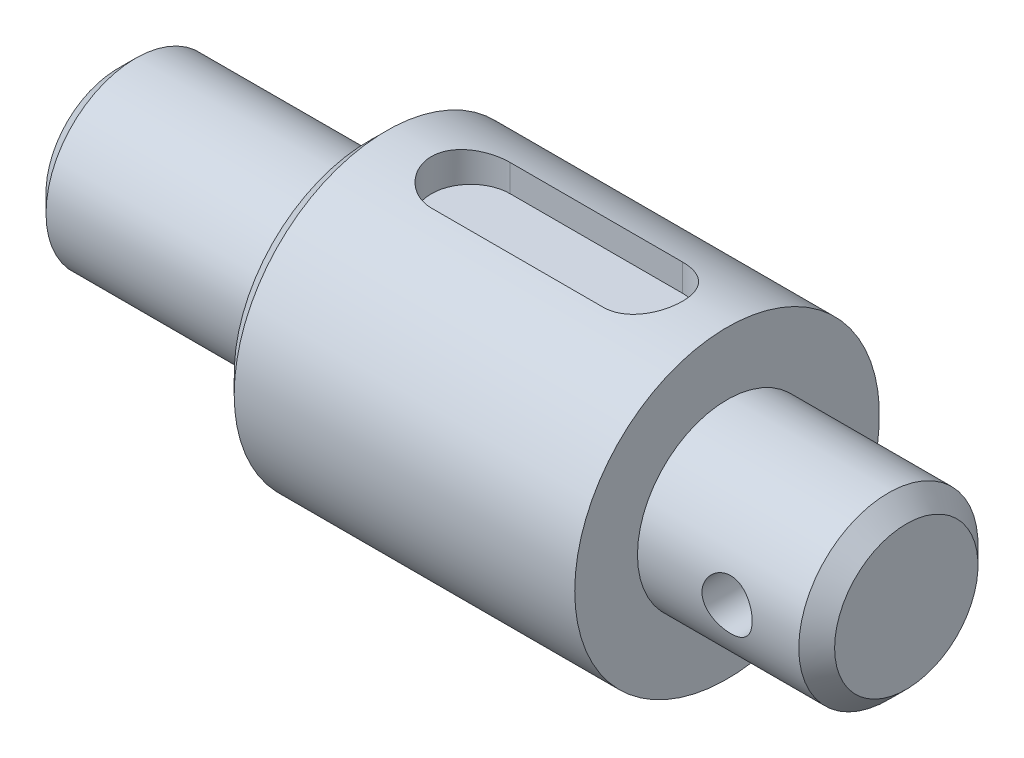
ISO-10303-21;
HEADER;
FILE_DESCRIPTION(('STEP AP214'),'2;1');
FILE_NAME('part.step','',(''),(''),'','','');
FILE_SCHEMA(('AUTOMOTIVE_DESIGN { 1 0 10303 214 1 1 1 1 }'));
ENDSEC;
DATA;
#1=APPLICATION_CONTEXT('core data for automotive mechanical design processes');
#2=APPLICATION_PROTOCOL_DEFINITION('international standard','automotive_design',2000,#1);
#3=PRODUCT_CONTEXT('',#1,'mechanical');
#4=PRODUCT('Part','Part','',(#3));
#5=PRODUCT_RELATED_PRODUCT_CATEGORY('part','',(#4));
#6=PRODUCT_DEFINITION_FORMATION('','',#4);
#7=PRODUCT_DEFINITION_CONTEXT('part definition',#1,'design');
#8=PRODUCT_DEFINITION('design','',#6,#7);
#9=PRODUCT_DEFINITION_SHAPE('','',#8);
#10=(LENGTH_UNIT() NAMED_UNIT(*) SI_UNIT(.MILLI.,.METRE.));
#11=(NAMED_UNIT(*) PLANE_ANGLE_UNIT() SI_UNIT($,.RADIAN.));
#12=(NAMED_UNIT(*) SI_UNIT($,.STERADIAN.) SOLID_ANGLE_UNIT());
#13=UNCERTAINTY_MEASURE_WITH_UNIT(LENGTH_MEASURE(1.E-05),#10,'distance_accuracy_value','');
#14=(GEOMETRIC_REPRESENTATION_CONTEXT(3) GLOBAL_UNCERTAINTY_ASSIGNED_CONTEXT((#13)) GLOBAL_UNIT_ASSIGNED_CONTEXT((#10,
#11,#12)) REPRESENTATION_CONTEXT('',''));
#15=CARTESIAN_POINT('',(0.,0.,0.));
#16=DIRECTION('',(0.,0.,1.));
#17=DIRECTION('',(1.,0.,0.));
#18=AXIS2_PLACEMENT_3D('',#15,#16,#17);
#19=CARTESIAN_POINT('',(0.,0.,0.));
#20=DIRECTION('',(-1.,0.,0.));
#21=DIRECTION('',(0.,0.,1.));
#22=AXIS2_PLACEMENT_3D('',#19,#20,#21);
#23=CYLINDRICAL_SURFACE('',#22,42.5);
#24=CARTESIAN_POINT('',(5.00000000000007,0.,0.));
#25=DIRECTION('',(1.,0.,0.));
#26=DIRECTION('',(0.,0.,-1.));
#27=AXIS2_PLACEMENT_3D('',#24,#25,#26);
#28=CIRCLE('',#27,42.5);
#29=CARTESIAN_POINT('',(5.00000000000007,0.,-42.5));
#30=VERTEX_POINT('',#29);
#31=EDGE_CURVE('E184',#30,#30,#28,.T.);
#32=ORIENTED_EDGE('',*,*,#31,.T.);
#33=EDGE_LOOP('',(#32));
#34=FACE_BOUND('',#33,.T.);
#35=CARTESIAN_POINT('',(100.,0.,0.));
#36=DIRECTION('',(-1.,0.,0.));
#37=DIRECTION('',(0.,0.,1.));
#38=AXIS2_PLACEMENT_3D('',#35,#36,#37);
#39=CIRCLE('',#38,42.5);
#40=CARTESIAN_POINT('',(100.,0.,42.5));
#41=VERTEX_POINT('',#40);
#42=EDGE_CURVE('E171',#41,#41,#39,.T.);
#43=ORIENTED_EDGE('',*,*,#42,.T.);
#44=EDGE_LOOP('',(#43));
#45=FACE_BOUND('',#44,.T.);
#46=CARTESIAN_POINT('',(76.5,41.051796550212,11.));
#47=CARTESIAN_POINT('',(76.8038247960372,41.0517600565118,11.0000389542306));
#48=CARTESIAN_POINT('',(77.1076367714444,41.0551682326324,10.9874140837727));
#49=CARTESIAN_POINT('',(77.7129813918098,41.0686081674394,10.9371235302487));
#50=CARTESIAN_POINT('',(78.014514431399,41.0786387514863,10.8994622879622));
#51=CARTESIAN_POINT('',(78.6125383491229,41.1050306264776,10.7994890289192));
#52=CARTESIAN_POINT('',(78.9090383580282,41.1213787941665,10.7372281060893));
#53=CARTESIAN_POINT('',(79.4955429173753,41.1599040034349,10.5885896094699));
#54=CARTESIAN_POINT('',(79.7855473655571,41.1820811367102,10.5022116562923));
#55=CARTESIAN_POINT('',(80.3569587250626,41.2316033657133,10.3060705109614));
#56=CARTESIAN_POINT('',(80.638368700337,41.2589465941317,10.1963157666392));
#57=CARTESIAN_POINT('',(81.1909337441658,41.3180270828473,9.95420329262288));
#58=CARTESIAN_POINT('',(81.4620849075802,41.3497659954088,9.82183705925984));
#59=CARTESIAN_POINT('',(81.9922337819806,41.4167295161546,9.53551866765559));
#60=CARTESIAN_POINT('',(82.2512332204764,41.4519536266503,9.38156959015381));
#61=CARTESIAN_POINT('',(82.7556058932019,41.5249358395073,9.05306668291794));
#62=CARTESIAN_POINT('',(83.000972813508,41.5626950984392,8.8785034207607));
#63=CARTESIAN_POINT('',(83.481459878544,41.640525790582,8.5060888668767));
#64=CARTESIAN_POINT('',(83.7162539321709,41.6806292223046,8.30782341742722));
#65=CARTESIAN_POINT('',(84.1683003877674,41.7612664734894,7.89248653985834));
#66=CARTESIAN_POINT('',(84.3855602836484,41.8018001006195,7.67542322885662));
#67=CARTESIAN_POINT('',(84.8013524344074,41.8822255157637,7.2236994530539));
#68=CARTESIAN_POINT('',(84.9998739445335,41.9221169247815,6.98902902893964));
#69=CARTESIAN_POINT('',(85.3766433414834,42.0001289519643,6.5038078492657));
#70=CARTESIAN_POINT('',(85.5548988224922,42.0382502302523,6.25326309738375));
#71=CARTESIAN_POINT('',(85.8925371639026,42.1122571236067,5.73390201211311));
#72=CARTESIAN_POINT('',(86.0515906699277,42.1480997664555,5.46486526447001));
#73=CARTESIAN_POINT('',(86.3464100576671,42.2158880021883,4.91384215852889));
#74=CARTESIAN_POINT('',(86.4821756323285,42.2478335436872,4.63185562954937));
#75=CARTESIAN_POINT('',(86.7293199755572,42.3069094034313,4.05695587135449));
#76=CARTESIAN_POINT('',(86.8407029071338,42.3340405435209,3.76404451741729));
#77=CARTESIAN_POINT('',(87.0381815007191,42.3827099496211,3.16936632313256));
#78=CARTESIAN_POINT('',(87.1242777961988,42.4042483557371,2.86759970483205));
#79=CARTESIAN_POINT('',(87.2688557907995,42.4407053090022,2.26405512187304));
#80=CARTESIAN_POINT('',(87.3278944946583,42.4557569624669,1.96241857625775));
#81=CARTESIAN_POINT('',(87.4205451242372,42.4794808711728,1.35501629776593));
#82=CARTESIAN_POINT('',(87.4541573807001,42.4881532093949,1.0492506186531));
#83=CARTESIAN_POINT('',(87.4956566003813,42.4988712932307,0.4358979251653));
#84=CARTESIAN_POINT('',(87.5035465339829,42.500917803987,0.128311125201218));
#85=CARTESIAN_POINT('',(87.4935388098912,42.4983278610524,-0.486412192507667));
#86=CARTESIAN_POINT('',(87.4756414967699,42.4936914966589,-0.793548716214219));
#87=CARTESIAN_POINT('',(87.4149524279946,42.4780573464952,-1.39778669305792));
#88=CARTESIAN_POINT('',(87.3727636678717,42.4672136833787,-1.69495294050582));
#89=CARTESIAN_POINT('',(87.2643196451943,42.4395785908353,-2.28457287339462));
#90=CARTESIAN_POINT('',(87.1980648301484,42.4227872720053,-2.57702664635843));
#91=CARTESIAN_POINT('',(87.0420248603992,42.3837066426528,-3.15521462031182));
#92=CARTESIAN_POINT('',(86.9522391254991,42.3614171965651,-3.44094865542495));
#93=CARTESIAN_POINT('',(86.7498402981266,42.3119321671073,-4.0037748141211));
#94=CARTESIAN_POINT('',(86.6372268634882,42.2847365101983,-4.28086680809616));
#95=CARTESIAN_POINT('',(86.3888617745791,42.2258795389272,-4.82713965074313));
#96=CARTESIAN_POINT('',(86.2529038758076,42.1941788957633,-5.09622246351621));
#97=CARTESIAN_POINT('',(85.9595317081342,42.1273348541285,-5.62209451939259));
#98=CARTESIAN_POINT('',(85.8021100242559,42.0921902670827,-5.87887947241421));
#99=CARTESIAN_POINT('',(85.4669444991805,42.0193924864097,-6.37843046167639));
#100=CARTESIAN_POINT('',(85.2892014608193,41.9817393919108,-6.62119705117068));
#101=CARTESIAN_POINT('',(84.9145661608773,41.9049080580115,-7.0912199355925));
#102=CARTESIAN_POINT('',(84.717673490958,41.8657297860997,-7.31847589960237));
#103=CARTESIAN_POINT('',(84.3000141469817,41.7857273649808,-7.76243119079863));
#104=CARTESIAN_POINT('',(84.07872004906,41.7448884678229,-7.97863198504914));
#105=CARTESIAN_POINT('',(83.6187234841881,41.663833176894,-8.39162010813873));
#106=CARTESIAN_POINT('',(83.3800263501476,41.6236165969641,-8.58841334101835));
#107=CARTESIAN_POINT('',(82.8866084401968,41.5449086919997,-8.96141290764789));
#108=CARTESIAN_POINT('',(82.6318803689277,41.5064181663039,-9.13760976264419));
#109=CARTESIAN_POINT('',(82.1081811379483,41.4322883836905,-9.46806022838166));
#110=CARTESIAN_POINT('',(81.8392104256986,41.3966490372858,-9.62231452793056));
#111=CARTESIAN_POINT('',(81.2871282267387,41.3290587682055,-9.9086165573765));
#112=CARTESIAN_POINT('',(81.0039402198341,41.2971317736082,-10.0405224882976));
#113=CARTESIAN_POINT('',(80.4269387114262,41.2381922978351,-10.279917478571));
#114=CARTESIAN_POINT('',(80.1331256909791,41.2111795944939,-10.3874076417665));
#115=CARTESIAN_POINT('',(79.5373426054097,41.1629373787932,-10.5769633921626));
#116=CARTESIAN_POINT('',(79.2353829202344,41.1417008569185,-10.6590598119541));
#117=CARTESIAN_POINT('',(78.6253224476552,41.1056483810211,-10.7972572848635));
#118=CARTESIAN_POINT('',(78.3172245997699,41.0908294274753,-10.8533704831951));
#119=CARTESIAN_POINT('',(77.7574803741889,41.0702937207026,-10.9307957004318));
#120=CARTESIAN_POINT('',(77.5065103580855,41.0633671545445,-10.9567539266736));
#121=CARTESIAN_POINT('',(77.0037004580398,41.0541141612397,-10.9913499362758));
#122=CARTESIAN_POINT('',(76.7518626149419,41.0517803736274,-11.0000154335734));
#123=CARTESIAN_POINT('',(76.5,41.051796550212,-11.));
#124=B_SPLINE_CURVE_WITH_KNOTS('',3,(#46,#47,#48,#49,#50,#51,#52,#53,#54,#55,#56,#57,#58,#59,
#60,#61,#62,#63,#64,#65,#66,#67,#68,#69,#70,#71,#72,#73,#74,#75,#76,#77,#78,#79,#80,#81,#82,#83,
#84,#85,#86,#87,#88,#89,#90,#91,#92,#93,#94,#95,#96,#97,#98,#99,#100,#101,#102,#103,#104,#105,
#106,#107,#108,#109,#110,#111,#112,#113,#114,#115,#116,#117,#118,#119,#120,#121,#122,#123),
.UNSPECIFIED.,.F.,.F.,(4,2,2,2,2,2,2,2,2,2,2,2,2,2,2,2,2,2,2,2,2,2,2,2,2,2,2,2,2,2,2,2,2,2,2,2,
2,2,4),(0.,0.911173502419548,1.82218543025096,2.73131503575788,3.64045894370677,
4.54927486384538,5.45843332456371,6.36746214370394,7.27690853028864,8.20557266918207,
9.13383778162453,10.0626319762603,10.9910769734126,11.9336842464295,12.8763039468247,
13.8187625818026,14.7611976046551,15.6832484773341,16.6052873559319,17.5272197547951,
18.4491398348059,19.3491049665557,20.2490533642994,21.1490239539614,22.0490080343384,
22.9573961446463,23.8660988697237,24.7747657070705,25.6834519246785,26.618538565395,
27.5533398569813,28.4885696779902,29.4237701343361,30.3646985689073,31.3055844553859,
32.2453234109839,33.1846226643562,33.9412170434728,34.6965979008401),.UNSPECIFIED.);
#125=CARTESIAN_POINT('',(76.5,41.051796550212,11.));
#126=VERTEX_POINT('',#125);
#127=CARTESIAN_POINT('',(76.5,41.051796550212,-11.));
#128=VERTEX_POINT('',#127);
#129=EDGE_CURVE('E111',#126,#128,#124,.T.);
#130=ORIENTED_EDGE('',*,*,#129,.F.);
#131=DIRECTION('',(-1.,0.,0.));
#132=VECTOR('',#131,1.);
#133=CARTESIAN_POINT('',(0.,41.051796550212,11.));
#134=LINE('',#133,#132);
#135=CARTESIAN_POINT('',(28.5,41.051796550212,11.));
#136=VERTEX_POINT('',#135);
#137=EDGE_CURVE('E47',#136,#126,#134,.F.);
#138=ORIENTED_EDGE('',*,*,#137,.F.);
#139=CARTESIAN_POINT('',(28.5,41.051796550212,-11.));
#140=CARTESIAN_POINT('',(28.1961752039628,41.0517600565118,-11.0000389542306));
#141=CARTESIAN_POINT('',(27.8923632285556,41.0551682326324,-10.9874140837727));
#142=CARTESIAN_POINT('',(27.2870186081902,41.0686081674394,-10.9371235302487));
#143=CARTESIAN_POINT('',(26.985485568601,41.0786387514863,-10.8994622879622));
#144=CARTESIAN_POINT('',(26.3874616508772,41.1050306264776,-10.7994890289192));
#145=CARTESIAN_POINT('',(26.0909616419719,41.1213787941665,-10.7372281060893));
#146=CARTESIAN_POINT('',(25.5044570826248,41.1599040034349,-10.5885896094699));
#147=CARTESIAN_POINT('',(25.214452634443,41.1820811367102,-10.5022116562923));
#148=CARTESIAN_POINT('',(24.6430412749374,41.2316033657133,-10.3060705109614));
#149=CARTESIAN_POINT('',(24.3616312996631,41.2589465941317,-10.1963157666392));
#150=CARTESIAN_POINT('',(23.8090662558342,41.3180270828473,-9.95420329262288));
#151=CARTESIAN_POINT('',(23.5379150924198,41.3497659954088,-9.82183705925984));
#152=CARTESIAN_POINT('',(23.0077662180195,41.4167295161546,-9.53551866765559));
#153=CARTESIAN_POINT('',(22.7487667795236,41.4519536266503,-9.38156959015381));
#154=CARTESIAN_POINT('',(22.2443941067982,41.5249358395073,-9.05306668291793));
#155=CARTESIAN_POINT('',(21.9990271864921,41.5626950984392,-8.87850342076069));
#156=CARTESIAN_POINT('',(21.5185401214561,41.640525790582,-8.50608886687669));
#157=CARTESIAN_POINT('',(21.2837460678291,41.6806292223046,-8.30782341742721));
#158=CARTESIAN_POINT('',(20.8316996122327,41.7612664734894,-7.89248653985833));
#159=CARTESIAN_POINT('',(20.6144397163517,41.8018001006196,-7.67542322885661));
#160=CARTESIAN_POINT('',(20.1986475655927,41.8822255157637,-7.22369945305389));
#161=CARTESIAN_POINT('',(20.0001260554665,41.9221169247815,-6.98902902893963));
#162=CARTESIAN_POINT('',(19.6233566585166,42.0001289519643,-6.50380784926569));
#163=CARTESIAN_POINT('',(19.4451011775079,42.0382502302523,-6.25326309738374));
#164=CARTESIAN_POINT('',(19.1074628360974,42.1122571236067,-5.73390201211311));
#165=CARTESIAN_POINT('',(18.9484093300723,42.1480997664555,-5.46486526447));
#166=CARTESIAN_POINT('',(18.653589942333,42.2158880021883,-4.91384215852888));
#167=CARTESIAN_POINT('',(18.5178243676715,42.2478335436872,-4.63185562954937));
#168=CARTESIAN_POINT('',(18.2706800244428,42.3069094034313,-4.05695587135448));
#169=CARTESIAN_POINT('',(18.1592970928662,42.3340405435209,-3.76404451741729));
#170=CARTESIAN_POINT('',(17.9618184992809,42.3827099496211,-3.16936632313255));
#171=CARTESIAN_POINT('',(17.8757222038012,42.4042483557371,-2.86759970483204));
#172=CARTESIAN_POINT('',(17.7311442092005,42.4407053090022,-2.26405512187302));
#173=CARTESIAN_POINT('',(17.6721055053418,42.4557569624669,-1.96241857625774));
#174=CARTESIAN_POINT('',(17.5794548757628,42.4794808711728,-1.35501629776592));
#175=CARTESIAN_POINT('',(17.5458426192999,42.4881532093949,-1.04925061865309));
#176=CARTESIAN_POINT('',(17.5043433996188,42.4988712932307,-0.435897925165289));
#177=CARTESIAN_POINT('',(17.4964534660171,42.500917803987,-0.128311125201207));
#178=CARTESIAN_POINT('',(17.5064611901089,42.4983278610524,0.486412192507678));
#179=CARTESIAN_POINT('',(17.5243585032301,42.4936914966589,0.793548716214231));
#180=CARTESIAN_POINT('',(17.5850475720055,42.4780573464952,1.39778669305793));
#181=CARTESIAN_POINT('',(17.6272363321283,42.4672136833787,1.69495294050583));
#182=CARTESIAN_POINT('',(17.7356803548057,42.4395785908353,2.28457287339463));
#183=CARTESIAN_POINT('',(17.8019351698517,42.4227872720053,2.57702664635845));
#184=CARTESIAN_POINT('',(17.9579751396009,42.3837066426528,3.15521462031183));
#185=CARTESIAN_POINT('',(18.0477608745009,42.3614171965651,3.44094865542497));
#186=CARTESIAN_POINT('',(18.2501597018735,42.3119321671073,4.00377481412112));
#187=CARTESIAN_POINT('',(18.3627731365119,42.2847365101983,4.28086680809618));
#188=CARTESIAN_POINT('',(18.611138225421,42.2258795389272,4.82713965074313));
#189=CARTESIAN_POINT('',(18.7470961241924,42.1941788957633,5.09622246351622));
#190=CARTESIAN_POINT('',(19.0404682918659,42.1273348541285,5.6220945193926));
#191=CARTESIAN_POINT('',(19.1978899757442,42.0921902670827,5.87887947241421));
#192=CARTESIAN_POINT('',(19.5330555008196,42.0193924864097,6.37843046167639));
#193=CARTESIAN_POINT('',(19.7107985391807,41.9817393919108,6.62119705117067));
#194=CARTESIAN_POINT('',(20.0854338391228,41.9049080580115,7.0912199355925));
#195=CARTESIAN_POINT('',(20.282326509042,41.8657297860997,7.31847589960238));
#196=CARTESIAN_POINT('',(20.6999858530183,41.7857273649808,7.76243119079864));
#197=CARTESIAN_POINT('',(20.9212799509401,41.7448884678229,7.97863198504915));
#198=CARTESIAN_POINT('',(21.3812765158119,41.663833176894,8.39162010813873));
#199=CARTESIAN_POINT('',(21.6199736498525,41.6236165969641,8.58841334101835));
#200=CARTESIAN_POINT('',(22.1133915598032,41.5449086919997,8.9614129076479));
#201=CARTESIAN_POINT('',(22.3681196310724,41.5064181663039,9.13760976264419));
#202=CARTESIAN_POINT('',(22.8918188620518,41.4322883836905,9.46806022838167));
#203=CARTESIAN_POINT('',(23.1607895743015,41.3966490372858,9.62231452793057));
#204=CARTESIAN_POINT('',(23.7128717732613,41.3290587682055,9.9086165573765));
#205=CARTESIAN_POINT('',(23.996059780166,41.2971317736082,10.0405224882976));
#206=CARTESIAN_POINT('',(24.5730612885738,41.2381922978351,10.279917478571));
#207=CARTESIAN_POINT('',(24.8668743090209,41.2111795944939,10.3874076417665));
#208=CARTESIAN_POINT('',(25.4626573945904,41.1629373787932,10.5769633921626));
#209=CARTESIAN_POINT('',(25.7646170797656,41.1417008569185,10.659059811954));
#210=CARTESIAN_POINT('',(26.3746775523449,41.1056483810211,10.7972572848635));
#211=CARTESIAN_POINT('',(26.6827754002302,41.0908294274753,10.8533704831951));
#212=CARTESIAN_POINT('',(27.2425196258112,41.0702937207026,10.9307957004318));
#213=CARTESIAN_POINT('',(27.4934896419145,41.0633671545445,10.9567539266736));
#214=CARTESIAN_POINT('',(27.9962995419603,41.0541141612397,10.9913499362758));
#215=CARTESIAN_POINT('',(28.2481373850582,41.0517803736274,11.0000154335734));
#216=CARTESIAN_POINT('',(28.5,41.051796550212,11.));
#217=B_SPLINE_CURVE_WITH_KNOTS('',3,(#139,#140,#141,#142,#143,#144,#145,#146,#147,#148,#149,
#150,#151,#152,#153,#154,#155,#156,#157,#158,#159,#160,#161,#162,#163,#164,#165,#166,#167,#168,
#169,#170,#171,#172,#173,#174,#175,#176,#177,#178,#179,#180,#181,#182,#183,#184,#185,#186,#187,
#188,#189,#190,#191,#192,#193,#194,#195,#196,#197,#198,#199,#200,#201,#202,#203,#204,#205,#206,
#207,#208,#209,#210,#211,#212,#213,#214,#215,#216),.UNSPECIFIED.,.F.,.F.,(4,2,2,2,2,2,2,2,2,2,2,
2,2,2,2,2,2,2,2,2,2,2,2,2,2,2,2,2,2,2,2,2,2,2,2,2,2,2,4),(0.,0.911173502419545,1.82218543025096,
2.73131503575789,3.64045894370678,4.54927486384539,5.45843332456372,6.36746214370395,
7.27690853028867,8.20557266918209,9.13383778162454,10.0626319762604,10.9910769734126,
11.9336842464295,12.8763039468247,13.8187625818026,14.7611976046551,15.6832484773342,
16.6052873559319,17.5272197547952,18.4491398348059,19.3491049665557,20.2490533642994,
21.1490239539614,22.0490080343384,22.9573961446463,23.8660988697237,24.7747657070705,
25.6834519246785,26.618538565395,27.5533398569813,28.4885696779902,29.4237701343362,
30.3646985689073,31.3055844553859,32.2453234109839,33.1846226643563,33.9412170434728,
34.6965979008401),.UNSPECIFIED.);
#218=CARTESIAN_POINT('',(28.5,41.051796550212,-11.));
#219=VERTEX_POINT('',#218);
#220=EDGE_CURVE('E62',#219,#136,#217,.T.);
#221=ORIENTED_EDGE('',*,*,#220,.F.);
#222=DIRECTION('',(-1.,0.,0.));
#223=VECTOR('',#222,1.);
#224=CARTESIAN_POINT('',(0.,41.051796550212,-11.));
#225=LINE('',#224,#223);
#226=EDGE_CURVE('E123',#128,#219,#225,.T.);
#227=ORIENTED_EDGE('',*,*,#226,.F.);
#228=EDGE_LOOP('',(#130,#138,#221,#227));
#229=FACE_BOUND('',#228,.T.);
#230=ADVANCED_FACE('F35',(#34,#45,#229),#23,.T.);
#231=CARTESIAN_POINT('',(0.,25.,0.));
#232=DIRECTION('',(1.,0.,0.));
#233=DIRECTION('',(0.,0.,-1.));
#234=AXIS2_PLACEMENT_3D('',#231,#232,#233);
#235=PLANE('',#234);
#236=CARTESIAN_POINT('',(0.,0.,0.));
#237=DIRECTION('',(1.,0.,0.));
#238=DIRECTION('',(0.,0.,-1.));
#239=AXIS2_PLACEMENT_3D('',#236,#237,#238);
#240=CIRCLE('',#239,37.5);
#241=CARTESIAN_POINT('',(0.,0.,-37.5));
#242=VERTEX_POINT('',#241);
#243=EDGE_CURVE('E175',#242,#242,#240,.F.);
#244=ORIENTED_EDGE('',*,*,#243,.T.);
#245=EDGE_LOOP('',(#244));
#246=FACE_BOUND('',#245,.T.);
#247=CARTESIAN_POINT('',(0.,0.,0.));
#248=DIRECTION('',(-1.,0.,0.));
#249=DIRECTION('',(0.,0.,1.));
#250=AXIS2_PLACEMENT_3D('',#247,#248,#249);
#251=CIRCLE('',#250,24.5);
#252=CARTESIAN_POINT('',(0.,0.,24.5));
#253=VERTEX_POINT('',#252);
#254=EDGE_CURVE('E172',#253,#253,#251,.T.);
#255=ORIENTED_EDGE('',*,*,#254,.F.);
#256=EDGE_LOOP('',(#255));
#257=FACE_BOUND('',#256,.T.);
#258=ADVANCED_FACE('F95',(#246,#257),#235,.F.);
#259=CARTESIAN_POINT('',(100.,42.5,0.));
#260=DIRECTION('',(-1.,0.,0.));
#261=DIRECTION('',(0.,0.,1.));
#262=AXIS2_PLACEMENT_3D('',#259,#260,#261);
#263=PLANE('',#262);
#264=ORIENTED_EDGE('',*,*,#42,.F.);
#265=EDGE_LOOP('',(#264));
#266=FACE_BOUND('',#265,.T.);
#267=CARTESIAN_POINT('',(100.,0.,0.));
#268=DIRECTION('',(-1.,0.,0.));
#269=DIRECTION('',(0.,0.,1.));
#270=AXIS2_PLACEMENT_3D('',#267,#268,#269);
#271=CIRCLE('',#270,25.);
#272=CARTESIAN_POINT('',(100.,0.,25.));
#273=VERTEX_POINT('',#272);
#274=EDGE_CURVE('E169',#273,#273,#271,.T.);
#275=ORIENTED_EDGE('',*,*,#274,.T.);
#276=EDGE_LOOP('',(#275));
#277=FACE_BOUND('',#276,.T.);
#278=ADVANCED_FACE('F101',(#266,#277),#263,.F.);
#279=CARTESIAN_POINT('',(0.,0.,0.));
#280=DIRECTION('',(-1.,0.,0.));
#281=DIRECTION('',(0.,0.,1.));
#282=AXIS2_PLACEMENT_3D('',#279,#280,#281);
#283=CYLINDRICAL_SURFACE('',#282,25.);
#284=CARTESIAN_POINT('',(132.,0.,25.));
#285=CARTESIAN_POINT('',(132.000007365484,-0.192641582454756,25.0000048368746));
#286=CARTESIAN_POINT('',(131.992047216758,-0.385209496926226,24.9977704663466));
#287=CARTESIAN_POINT('',(131.960294264796,-0.768985970182058,24.9889060866357));
#288=CARTESIAN_POINT('',(131.93650027844,-0.960194426307281,24.982275748982));
#289=CARTESIAN_POINT('',(131.873274351461,-1.33983267753282,24.9647949895165));
#290=CARTESIAN_POINT('',(131.833839773334,-1.52826199842078,24.9539438559496));
#291=CARTESIAN_POINT('',(131.739656106432,-1.90105420231049,24.9283154192436));
#292=CARTESIAN_POINT('',(131.684901363272,-2.08541555674669,24.9135366665956));
#293=CARTESIAN_POINT('',(131.560643462776,-2.44840649216001,24.880483634183));
#294=CARTESIAN_POINT('',(131.491166461499,-2.62704559992792,24.862215559268));
#295=CARTESIAN_POINT('',(131.337925021617,-2.97781048448544,24.8226472088198));
#296=CARTESIAN_POINT('',(131.254155299487,-3.14993382376622,24.8013458124556));
#297=CARTESIAN_POINT('',(131.072984624388,-3.48645233962024,24.7562810345526));
#298=CARTESIAN_POINT('',(130.975587945735,-3.65084991798556,24.7325184256174));
#299=CARTESIAN_POINT('',(130.767826868446,-3.97097457085777,24.6831449970423));
#300=CARTESIAN_POINT('',(130.657457504003,-4.12669829126375,24.6575334711131));
#301=CARTESIAN_POINT('',(130.302742159577,-4.58613327490882,24.5777371846533));
#302=CARTESIAN_POINT('',(130.038772594172,-4.87470196103998,24.5216246181892));
#303=CARTESIAN_POINT('',(129.466350933376,-5.40404439872969,24.4104443487601));
#304=CARTESIAN_POINT('',(129.157892478593,-5.64481130562644,24.3553767964483));
#305=CARTESIAN_POINT('',(128.664905894806,-5.96725766878766,24.2776517201167));
#306=CARTESIAN_POINT('',(128.493683608884,-6.06909441047663,24.2523314763058));
#307=CARTESIAN_POINT('',(128.142923889062,-6.25792635526698,24.2042940669786));
#308=CARTESIAN_POINT('',(127.963389758903,-6.34492739185991,24.1815758794766));
#309=CARTESIAN_POINT('',(127.597184064762,-6.50341953531222,24.1394338496535));
#310=CARTESIAN_POINT('',(127.410510769494,-6.57490685159367,24.1200108127125));
#311=CARTESIAN_POINT('',(127.031475710427,-6.70171757355433,24.0850848087841));
#312=CARTESIAN_POINT('',(126.839116420475,-6.75704789802139,24.0695801642367));
#313=CARTESIAN_POINT('',(126.45481057965,-6.84993811969496,24.0433072240293));
#314=CARTESIAN_POINT('',(126.262967799154,-6.88789752672825,24.0324328952391));
#315=CARTESIAN_POINT('',(125.876651759252,-6.94763745220833,24.0152306468314));
#316=CARTESIAN_POINT('',(125.682179572814,-6.96942437858595,24.0089009265619));
#317=CARTESIAN_POINT('',(125.291995418281,-6.99664103321637,24.0009836485262));
#318=CARTESIAN_POINT('',(125.096283437869,-7.00207059870374,23.9993961379478));
#319=CARTESIAN_POINT('',(124.705114141916,-6.99652065465991,24.0010147240902));
#320=CARTESIAN_POINT('',(124.509656821805,-6.98554144385549,24.0042207335436));
#321=CARTESIAN_POINT('',(124.126564761406,-6.94787685539769,24.015148850276));
#322=CARTESIAN_POINT('',(123.938876359729,-6.92169271091975,24.0227267867948));
#323=CARTESIAN_POINT('',(123.56638381802,-6.85423822761176,24.0420599783823));
#324=CARTESIAN_POINT('',(123.381580684744,-6.81296274044623,24.0538166589701));
#325=CARTESIAN_POINT('',(123.016245464534,-6.7156862516557,24.0811566603437));
#326=CARTESIAN_POINT('',(122.835712106324,-6.65968969478474,24.0967388260014));
#327=CARTESIAN_POINT('',(122.479983493076,-6.53338774335152,24.1312894118766));
#328=CARTESIAN_POINT('',(122.30479027624,-6.46307696211426,24.1502591065452));
#329=CARTESIAN_POINT('',(121.958885400374,-6.30777219792868,24.1912904397662));
#330=CARTESIAN_POINT('',(121.788251583979,-6.22261388863915,24.2133860954139));
#331=CARTESIAN_POINT('',(121.454678738498,-6.0387893499187,24.2598847930174));
#332=CARTESIAN_POINT('',(121.29174237854,-5.94011848051872,24.2842886266655));
#333=CARTESIAN_POINT('',(120.974620563653,-5.72996540342663,24.3347317478457));
#334=CARTESIAN_POINT('',(120.820435184109,-5.61848308539457,24.3607710494624));
#335=CARTESIAN_POINT('',(120.521742237285,-5.38343075709103,24.4137908840487));
#336=CARTESIAN_POINT('',(120.377234907547,-5.25986045030978,24.4407714400962));
#337=CARTESIAN_POINT('',(120.093706037277,-4.99670237655509,24.4959524142398));
#338=CARTESIAN_POINT('',(119.955074657161,-4.85669573420451,24.5241615330591));
#339=CARTESIAN_POINT('',(119.690098442198,-4.56548871852533,24.5800382888069));
#340=CARTESIAN_POINT('',(119.563749608034,-4.41429201722218,24.6077060996309));
#341=CARTESIAN_POINT('',(119.324091940398,-4.10157168256749,24.6617577239572));
#342=CARTESIAN_POINT('',(119.210788675883,-3.94004368437123,24.6881409863519));
#343=CARTESIAN_POINT('',(118.998133372362,-3.60783553711138,24.7388710543018));
#344=CARTESIAN_POINT('',(118.898775893451,-3.437158992771,24.7632186524121));
#345=CARTESIAN_POINT('',(118.714188527348,-3.08674710492108,24.8093407947669));
#346=CARTESIAN_POINT('',(118.629041189987,-2.90696623482902,24.8311001067143));
#347=CARTESIAN_POINT('',(118.474272851172,-2.54055533793557,24.8712590799841));
#348=CARTESIAN_POINT('',(118.404646005662,-2.3539279200511,24.8896600053922));
#349=CARTESIAN_POINT('',(118.281471006858,-1.97510428096995,24.9225822673875));
#350=CARTESIAN_POINT('',(118.227922786852,-1.78290808288227,24.9371036200713));
#351=CARTESIAN_POINT('',(118.137385472124,-1.39438339374564,24.9618424496912));
#352=CARTESIAN_POINT('',(118.10039585678,-1.19805503282012,24.9720600619416));
#353=CARTESIAN_POINT('',(118.0442205366,-0.809028636476646,24.9876402376228));
#354=CARTESIAN_POINT('',(118.024508749084,-0.616412164366546,24.9931461307695));
#355=CARTESIAN_POINT('',(118.001108986057,-0.230133945236286,24.9996869524286));
#356=CARTESIAN_POINT('',(117.997420680741,-0.0364722198122775,25.000721972963));
#357=CARTESIAN_POINT('',(118.00610035504,0.350441333593768,24.9982922512789));
#358=CARTESIAN_POINT('',(118.018466650674,0.543693202436474,24.9948279809946));
#359=CARTESIAN_POINT('',(118.059141288711,0.928379931120652,24.9834973279778));
#360=CARTESIAN_POINT('',(118.087449541326,1.1198148011896,24.9756309700386));
#361=CARTESIAN_POINT('',(118.159053255449,1.49577857365808,24.9559090094473));
#362=CARTESIAN_POINT('',(118.202046583763,1.68036937942645,24.9441339528832));
#363=CARTESIAN_POINT('',(118.302782293847,2.04526565123164,24.9168692823481));
#364=CARTESIAN_POINT('',(118.360529641058,2.22556965217692,24.9013784179351));
#365=CARTESIAN_POINT('',(118.490292159925,2.58058397556115,24.8670944070029));
#366=CARTESIAN_POINT('',(118.562303432356,2.75529581156112,24.8483021631159));
#367=CARTESIAN_POINT('',(118.720091750909,3.0981243622889,24.8078905249726));
#368=CARTESIAN_POINT('',(118.805873972589,3.26623856773923,24.7862700683524));
#369=CARTESIAN_POINT('',(118.992486160354,3.59816233285695,24.7402885857587));
#370=CARTESIAN_POINT('',(119.093590578906,3.76181102434372,24.7158801389436));
#371=CARTESIAN_POINT('',(119.308812641941,4.08011150484559,24.6653334048147));
#372=CARTESIAN_POINT('',(119.422934789364,4.23476015256679,24.6391945202482));
#373=CARTESIAN_POINT('',(119.663407116349,4.53405202476663,24.5858797103949));
#374=CARTESIAN_POINT('',(119.789757578658,4.67869501775938,24.5587037611375));
#375=CARTESIAN_POINT('',(120.053877640146,4.95708489002918,24.5040289957273));
#376=CARTESIAN_POINT('',(120.191647419206,5.09083159759934,24.4765301744943));
#377=CARTESIAN_POINT('',(120.482268764932,5.35063368123559,24.4210752891647));
#378=CARTESIAN_POINT('',(120.635459017975,5.47631328327866,24.3931321699227));
#379=CARTESIAN_POINT('',(120.952027610451,5.71429075659921,24.3384836582408));
#380=CARTESIAN_POINT('',(121.115402458046,5.82659317628753,24.3117778469986));
#381=CARTESIAN_POINT('',(121.451380765738,6.03710305895722,24.2603614069092));
#382=CARTESIAN_POINT('',(121.623987573438,6.13530536087772,24.2356515100661));
#383=CARTESIAN_POINT('',(121.977148205148,6.31678429040779,24.1889854355811));
#384=CARTESIAN_POINT('',(122.157698759393,6.40006698886979,24.1670281389908));
#385=CARTESIAN_POINT('',(122.524616385219,6.55069471997233,24.126633673625));
#386=CARTESIAN_POINT('',(122.710948712981,6.61811962292819,24.1081789585095));
#387=CARTESIAN_POINT('',(123.088909211749,6.7369845157587,24.0752330569171));
#388=CARTESIAN_POINT('',(123.28053526649,6.78843079549341,24.0607403111119));
#389=CARTESIAN_POINT('',(123.667728081871,6.87491079465854,24.0361732758378));
#390=CARTESIAN_POINT('',(123.863294665431,6.90994524989386,24.0260987882828));
#391=CARTESIAN_POINT('',(124.256880398472,6.96327565261612,24.0106969186872));
#392=CARTESIAN_POINT('',(124.454899469489,6.98157213421414,24.0053693851706));
#393=CARTESIAN_POINT('',(124.844607853155,7.00089410771045,23.9997411574088));
#394=CARTESIAN_POINT('',(125.036264879671,7.00252465558123,23.9992643604436));
#395=CARTESIAN_POINT('',(125.419091253952,6.99006805609579,24.0028954785986));
#396=CARTESIAN_POINT('',(125.610260411815,6.97597551533209,24.0070049669279));
#397=CARTESIAN_POINT('',(125.990574334558,6.93219935125799,24.0196821130944));
#398=CARTESIAN_POINT('',(126.179719888615,6.90252205009985,24.0282479631397));
#399=CARTESIAN_POINT('',(126.554787176677,6.82782649301004,24.0495798672687));
#400=CARTESIAN_POINT('',(126.740707681033,6.78280251516596,24.0623474878948));
#401=CARTESIAN_POINT('',(127.106160808138,6.67831208548582,24.0915557192754));
#402=CARTESIAN_POINT('',(127.285738181517,6.61899152302237,24.107959101094));
#403=CARTESIAN_POINT('',(127.639279328496,6.48612970994851,24.1440439399461));
#404=CARTESIAN_POINT('',(127.813241170257,6.41258362509003,24.1637265110277));
#405=CARTESIAN_POINT('',(128.154379486999,6.25183518082745,24.2058144877262));
#406=CARTESIAN_POINT('',(128.321556285825,6.1646334741638,24.2282197631861));
#407=CARTESIAN_POINT('',(128.648117254984,5.97718067095984,24.2751445455921));
#408=CARTESIAN_POINT('',(128.807501156485,5.87692912467541,24.299664125395));
#409=CARTESIAN_POINT('',(129.122543634776,5.66059342370075,24.3509842331171));
#410=CARTESIAN_POINT('',(129.27791476788,5.5441019126945,24.3778328958746));
#411=CARTESIAN_POINT('',(129.578315038229,5.29873874941686,24.4323382407079));
#412=CARTESIAN_POINT('',(129.723347358421,5.16987093628857,24.459994670373));
#413=CARTESIAN_POINT('',(130.00229597812,4.90047472322126,24.515388312295));
#414=CARTESIAN_POINT('',(130.136205755588,4.75993957701338,24.5431255622142));
#415=CARTESIAN_POINT('',(130.391908518052,4.46821353426485,24.5979081078344));
#416=CARTESIAN_POINT('',(130.513705827108,4.3170264735468,24.6249536478908));
#417=CARTESIAN_POINT('',(130.747287318338,4.00102956476777,24.6782912620635));
#418=CARTESIAN_POINT('',(130.858749039878,3.83597515380522,24.7045481172563));
#419=CARTESIAN_POINT('',(131.067298775543,3.49678582050536,24.7548353857463));
#420=CARTESIAN_POINT('',(131.164392048224,3.32265425192877,24.7788666123669));
#421=CARTESIAN_POINT('',(131.343476989556,2.96648019965321,24.8240243114546));
#422=CARTESIAN_POINT('',(131.42547318896,2.78444010970131,24.8451516549162));
#423=CARTESIAN_POINT('',(131.573709504046,2.41375662623156,24.8839017312087));
#424=CARTESIAN_POINT('',(131.639951509175,2.22511402768858,24.9015248842661));
#425=CARTESIAN_POINT('',(131.797723609807,1.70543781347246,24.9439296862512));
#426=CARTESIAN_POINT('',(131.873422574724,1.3691206767987,24.9648079088289));
#427=CARTESIAN_POINT('',(131.974551118882,0.688456682835641,24.9928379067278));
#428=CARTESIAN_POINT('',(131.999986843221,0.344110812334541,24.9999913600127));
#429=CARTESIAN_POINT('',(132.,0.,25.));
#430=B_SPLINE_CURVE_WITH_KNOTS('',3,(#284,#285,#286,#287,#288,#289,#290,#291,#292,#293,#294,
#295,#296,#297,#298,#299,#300,#301,#302,#303,#304,#305,#306,#307,#308,#309,#310,#311,#312,#313,
#314,#315,#316,#317,#318,#319,#320,#321,#322,#323,#324,#325,#326,#327,#328,#329,#330,#331,#332,
#333,#334,#335,#336,#337,#338,#339,#340,#341,#342,#343,#344,#345,#346,#347,#348,#349,#350,#351,
#352,#353,#354,#355,#356,#357,#358,#359,#360,#361,#362,#363,#364,#365,#366,#367,#368,#369,#370,
#371,#372,#373,#374,#375,#376,#377,#378,#379,#380,#381,#382,#383,#384,#385,#386,#387,#388,#389,
#390,#391,#392,#393,#394,#395,#396,#397,#398,#399,#400,#401,#402,#403,#404,#405,#406,#407,#408,
#409,#410,#411,#412,#413,#414,#415,#416,#417,#418,#419,#420,#421,#422,#423,#424,#425,#426,#427,
#428,#429),.UNSPECIFIED.,.T.,.F.,(4,2,2,2,2,2,2,2,2,2,2,2,2,2,2,2,2,2,2,2,2,2,2,2,2,2,2,2,2,2,2,
2,2,2,2,2,2,2,2,2,2,2,2,2,2,2,2,2,2,2,2,2,2,2,2,2,2,2,2,2,2,2,2,2,2,2,2,2,2,2,2,2,4),(0.,
0.577620723931445,1.15528461307628,1.73304595625345,2.31102082214671,2.88797732108106,
3.46514756484927,4.0421371740315,4.61934837254331,5.798883453812,6.97858730924276,
7.58042928174624,8.18203405781087,8.78378566317095,9.38527920577896,9.97214207823279,
10.5587722970179,11.1454083531017,11.7320337294273,12.3003380287258,12.8688363833407,
13.4371632871625,14.0057044582704,14.5809917364451,15.1564770555327,15.7319673314192,
16.3074717272147,16.9038889121887,17.5001112428996,18.0965871556785,18.6928297475256,
19.2924237945318,19.8917916887579,20.491157096119,21.090503657384,21.6708947663344,
22.2512739292847,22.8315922207043,23.4119072437047,23.9809379206326,24.5501603568022,
25.1192274030492,25.6885088255816,26.2695605595896,26.8508138971183,27.4320806777432,
28.0133566163714,28.6129711156278,29.2123811528888,29.812010035706,30.4113943699288,
31.0076918668125,31.6037543374803,32.1997900818281,32.7958068059282,33.3701048106421,
33.9445998743302,34.5188620667595,35.0933386038847,35.6621841829233,36.2312234130201,
36.8002354512677,37.3692671048979,37.9567122257785,38.5439757055009,39.1315811489923,
39.7189760629853,40.3209099999386,40.9226230937282,41.5241553132071,42.1256153527046,
43.1575308883276,44.1893202559217),.UNSPECIFIED.);
#431=CARTESIAN_POINT('',(132.,0.,25.));
#432=VERTEX_POINT('',#431);
#433=EDGE_CURVE('E11',#432,#432,#430,.T.);
#434=ORIENTED_EDGE('',*,*,#433,.T.);
#435=EDGE_LOOP('',(#434));
#436=FACE_BOUND('',#435,.T.);
#437=CARTESIAN_POINT('',(145.,0.,0.));
#438=DIRECTION('',(-1.,0.,0.));
#439=DIRECTION('',(0.,0.,1.));
#440=AXIS2_PLACEMENT_3D('',#437,#438,#439);
#441=CIRCLE('',#440,25.);
#442=CARTESIAN_POINT('',(145.,0.,25.));
#443=VERTEX_POINT('',#442);
#444=EDGE_CURVE('E166',#443,#443,#441,.T.);
#445=ORIENTED_EDGE('',*,*,#444,.T.);
#446=EDGE_LOOP('',(#445));
#447=FACE_BOUND('',#446,.T.);
#448=ORIENTED_EDGE('',*,*,#274,.F.);
#449=EDGE_LOOP('',(#448));
#450=FACE_BOUND('',#449,.T.);
#451=ADVANCED_FACE('F152',(#436,#447,#450),#283,.T.);
#452=CARTESIAN_POINT('',(150.,25.,0.));
#453=DIRECTION('',(-1.,0.,0.));
#454=DIRECTION('',(0.,0.,1.));
#455=AXIS2_PLACEMENT_3D('',#452,#453,#454);
#456=PLANE('',#455);
#457=CARTESIAN_POINT('',(150.,0.,0.));
#458=DIRECTION('',(-1.,0.,0.));
#459=DIRECTION('',(0.,0.,1.));
#460=AXIS2_PLACEMENT_3D('',#457,#458,#459);
#461=CIRCLE('',#460,19.9999999999999);
#462=CARTESIAN_POINT('',(150.,0.,19.9999999999999));
#463=VERTEX_POINT('',#462);
#464=EDGE_CURVE('E187',#463,#463,#461,.F.);
#465=ORIENTED_EDGE('',*,*,#464,.T.);
#466=EDGE_LOOP('',(#465));
#467=FACE_BOUND('',#466,.T.);
#468=ADVANCED_FACE('F149',(#467),#456,.F.);
#469=CARTESIAN_POINT('',(0.,0.,0.));
#470=DIRECTION('',(1.,0.,0.));
#471=DIRECTION('',(0.,0.,-1.));
#472=AXIS2_PLACEMENT_3D('',#469,#470,#471);
#473=CONICAL_SURFACE('',#472,37.5,0.785398163397447);
#474=ORIENTED_EDGE('',*,*,#31,.F.);
#475=EDGE_LOOP('',(#474));
#476=FACE_BOUND('',#475,.T.);
#477=ORIENTED_EDGE('',*,*,#243,.F.);
#478=EDGE_LOOP('',(#477));
#479=FACE_BOUND('',#478,.T.);
#480=ADVANCED_FACE('F151',(#476,#479),#473,.T.);
#481=CARTESIAN_POINT('',(145.,0.,0.));
#482=DIRECTION('',(-1.,0.,0.));
#483=DIRECTION('',(0.,0.,1.));
#484=AXIS2_PLACEMENT_3D('',#481,#482,#483);
#485=CONICAL_SURFACE('',#484,25.,0.785398163397454);
#486=ORIENTED_EDGE('',*,*,#464,.F.);
#487=EDGE_LOOP('',(#486));
#488=FACE_BOUND('',#487,.T.);
#489=ORIENTED_EDGE('',*,*,#444,.F.);
#490=EDGE_LOOP('',(#489));
#491=FACE_BOUND('',#490,.T.);
#492=ADVANCED_FACE('F147',(#488,#491),#485,.T.);
#493=CARTESIAN_POINT('',(-2.,0.,0.));
#494=DIRECTION('',(-1.,0.,0.));
#495=DIRECTION('',(0.,0.,1.));
#496=AXIS2_PLACEMENT_3D('',#493,#494,#495);
#497=TOROIDAL_SURFACE('',#496,24.5,2.);
#498=ORIENTED_EDGE('',*,*,#254,.T.);
#499=EDGE_LOOP('',(#498));
#500=FACE_BOUND('',#499,.T.);
#501=CARTESIAN_POINT('',(-2.,0.,0.));
#502=DIRECTION('',(-1.,0.,0.));
#503=DIRECTION('',(0.,0.,1.));
#504=AXIS2_PLACEMENT_3D('',#501,#502,#503);
#505=CIRCLE('',#504,22.5);
#506=CARTESIAN_POINT('',(-2.,0.,22.5));
#507=VERTEX_POINT('',#506);
#508=EDGE_CURVE('E178',#507,#507,#505,.T.);
#509=ORIENTED_EDGE('',*,*,#508,.F.);
#510=EDGE_LOOP('',(#509));
#511=FACE_BOUND('',#510,.T.);
#512=ADVANCED_FACE('F143',(#500,#511),#497,.F.);
#513=CARTESIAN_POINT('',(0.,0.,0.));
#514=DIRECTION('',(-1.,0.,0.));
#515=DIRECTION('',(0.,0.,1.));
#516=AXIS2_PLACEMENT_3D('',#513,#514,#515);
#517=CYLINDRICAL_SURFACE('',#516,22.5);
#518=ORIENTED_EDGE('',*,*,#508,.T.);
#519=EDGE_LOOP('',(#518));
#520=FACE_BOUND('',#519,.T.);
#521=CARTESIAN_POINT('',(-5.08578643762688,0.,0.));
#522=DIRECTION('',(-1.,0.,0.));
#523=DIRECTION('',(0.,0.,1.));
#524=AXIS2_PLACEMENT_3D('',#521,#522,#523);
#525=CIRCLE('',#524,22.5);
#526=CARTESIAN_POINT('',(-5.08578643762688,0.,22.5));
#527=VERTEX_POINT('',#526);
#528=EDGE_CURVE('E223',#527,#527,#525,.T.);
#529=ORIENTED_EDGE('',*,*,#528,.F.);
#530=EDGE_LOOP('',(#529));
#531=FACE_BOUND('',#530,.T.);
#532=ADVANCED_FACE('F139',(#520,#531),#517,.T.);
#533=CARTESIAN_POINT('',(-5.08578643762688,0.,0.));
#534=DIRECTION('',(-1.,0.,0.));
#535=DIRECTION('',(0.,0.,1.));
#536=AXIS2_PLACEMENT_3D('',#533,#534,#535);
#537=TOROIDAL_SURFACE('',#536,23.5,1.);
#538=ORIENTED_EDGE('',*,*,#528,.T.);
#539=EDGE_LOOP('',(#538));
#540=FACE_BOUND('',#539,.T.);
#541=CARTESIAN_POINT('',(-5.79289321881342,0.,0.));
#542=DIRECTION('',(-1.,0.,0.));
#543=DIRECTION('',(0.,0.,1.));
#544=AXIS2_PLACEMENT_3D('',#541,#542,#543);
#545=CIRCLE('',#544,22.7928932188134);
#546=CARTESIAN_POINT('',(-5.79289321881342,0.,22.7928932188134));
#547=VERTEX_POINT('',#546);
#548=EDGE_CURVE('E216',#547,#547,#545,.T.);
#549=ORIENTED_EDGE('',*,*,#548,.F.);
#550=EDGE_LOOP('',(#549));
#551=FACE_BOUND('',#550,.T.);
#552=ADVANCED_FACE('F135',(#540,#551),#537,.F.);
#553=CARTESIAN_POINT('',(-8.,0.,0.));
#554=DIRECTION('',(-1.,0.,0.));
#555=DIRECTION('',(0.,0.,1.));
#556=AXIS2_PLACEMENT_3D('',#553,#554,#555);
#557=CONICAL_SURFACE('',#556,25.,0.785398163397443);
#558=ORIENTED_EDGE('',*,*,#548,.T.);
#559=EDGE_LOOP('',(#558));
#560=FACE_BOUND('',#559,.T.);
#561=CARTESIAN_POINT('',(-8.,0.,0.));
#562=DIRECTION('',(-1.,0.,0.));
#563=DIRECTION('',(0.,0.,1.));
#564=AXIS2_PLACEMENT_3D('',#561,#562,#563);
#565=CIRCLE('',#564,25.);
#566=CARTESIAN_POINT('',(-8.,0.,25.));
#567=VERTEX_POINT('',#566);
#568=EDGE_CURVE('E213',#567,#567,#565,.T.);
#569=ORIENTED_EDGE('',*,*,#568,.F.);
#570=EDGE_LOOP('',(#569));
#571=FACE_BOUND('',#570,.T.);
#572=ADVANCED_FACE('F131',(#560,#571),#557,.T.);
#573=CARTESIAN_POINT('',(-70.,0.,0.));
#574=DIRECTION('',(1.,0.,0.));
#575=DIRECTION('',(0.,0.,-1.));
#576=AXIS2_PLACEMENT_3D('',#573,#574,#575);
#577=PLANE('',#576);
#578=CARTESIAN_POINT('',(-70.,0.,0.));
#579=DIRECTION('',(1.,0.,0.));
#580=DIRECTION('',(0.,0.,-1.));
#581=AXIS2_PLACEMENT_3D('',#578,#579,#580);
#582=CIRCLE('',#581,20.);
#583=CARTESIAN_POINT('',(-70.,0.,-20.));
#584=VERTEX_POINT('',#583);
#585=EDGE_CURVE('E190',#584,#584,#582,.F.);
#586=ORIENTED_EDGE('',*,*,#585,.T.);
#587=EDGE_LOOP('',(#586));
#588=FACE_BOUND('',#587,.T.);
#589=ADVANCED_FACE('F134',(#588),#577,.F.);
#590=CARTESIAN_POINT('',(-70.,0.,0.));
#591=DIRECTION('',(1.,0.,0.));
#592=DIRECTION('',(0.,0.,-1.));
#593=AXIS2_PLACEMENT_3D('',#590,#591,#592);
#594=CONICAL_SURFACE('',#593,20.,0.785398163397445);
#595=CARTESIAN_POINT('',(-65.,0.,0.));
#596=DIRECTION('',(1.,0.,0.));
#597=DIRECTION('',(0.,0.,-1.));
#598=AXIS2_PLACEMENT_3D('',#595,#596,#597);
#599=CIRCLE('',#598,25.);
#600=CARTESIAN_POINT('',(-65.,0.,-25.));
#601=VERTEX_POINT('',#600);
#602=EDGE_CURVE('E192',#601,#601,#599,.T.);
#603=ORIENTED_EDGE('',*,*,#602,.F.);
#604=EDGE_LOOP('',(#603));
#605=FACE_BOUND('',#604,.T.);
#606=ORIENTED_EDGE('',*,*,#585,.F.);
#607=EDGE_LOOP('',(#606));
#608=FACE_BOUND('',#607,.T.);
#609=ADVANCED_FACE('F37',(#605,#608),#594,.T.);
#610=CARTESIAN_POINT('',(0.,0.,0.));
#611=DIRECTION('',(-1.,0.,0.));
#612=DIRECTION('',(0.,0.,1.));
#613=AXIS2_PLACEMENT_3D('',#610,#611,#612);
#614=CYLINDRICAL_SURFACE('',#613,25.);
#615=ORIENTED_EDGE('',*,*,#602,.T.);
#616=EDGE_LOOP('',(#615));
#617=FACE_BOUND('',#616,.T.);
#618=ORIENTED_EDGE('',*,*,#568,.T.);
#619=EDGE_LOOP('',(#618));
#620=FACE_BOUND('',#619,.T.);
#621=ADVANCED_FACE('F130',(#617,#620),#614,.T.);
#622=CARTESIAN_POINT('',(28.5,42.5,0.));
#623=DIRECTION('',(0.,-1.,0.));
#624=DIRECTION('',(0.,0.,-1.));
#625=AXIS2_PLACEMENT_3D('',#622,#623,#624);
#626=CYLINDRICAL_SURFACE('',#625,11.);
#627=DIRECTION('',(0.,-1.,0.));
#628=VECTOR('',#627,1.);
#629=CARTESIAN_POINT('',(28.5,42.5,-11.));
#630=LINE('',#629,#628);
#631=CARTESIAN_POINT('',(28.5,33.5,-11.));
#632=VERTEX_POINT('',#631);
#633=EDGE_CURVE('E389',#219,#632,#630,.T.);
#634=ORIENTED_EDGE('',*,*,#633,.F.);
#635=ORIENTED_EDGE('',*,*,#220,.T.);
#636=DIRECTION('',(0.,-1.,0.));
#637=VECTOR('',#636,1.);
#638=CARTESIAN_POINT('',(28.5,42.5,11.));
#639=LINE('',#638,#637);
#640=CARTESIAN_POINT('',(28.5,33.5,11.));
#641=VERTEX_POINT('',#640);
#642=EDGE_CURVE('E209',#136,#641,#639,.T.);
#643=ORIENTED_EDGE('',*,*,#642,.T.);
#644=CARTESIAN_POINT('',(28.5,33.5,0.));
#645=DIRECTION('',(0.,1.,0.));
#646=DIRECTION('',(0.,0.,1.));
#647=AXIS2_PLACEMENT_3D('',#644,#645,#646);
#648=CIRCLE('',#647,11.);
#649=EDGE_CURVE('E378',#632,#641,#648,.T.);
#650=ORIENTED_EDGE('',*,*,#649,.F.);
#651=EDGE_LOOP('',(#634,#635,#643,#650));
#652=FACE_BOUND('',#651,.T.);
#653=ADVANCED_FACE('F124',(#652),#626,.F.);
#654=CARTESIAN_POINT('',(28.5,42.5,11.));
#655=DIRECTION('',(0.,0.,-1.));
#656=DIRECTION('',(-1.,0.,0.));
#657=AXIS2_PLACEMENT_3D('',#654,#655,#656);
#658=PLANE('',#657);
#659=ORIENTED_EDGE('',*,*,#137,.T.);
#660=DIRECTION('',(0.,-1.,0.));
#661=VECTOR('',#660,1.);
#662=CARTESIAN_POINT('',(76.5,42.5,11.));
#663=LINE('',#662,#661);
#664=CARTESIAN_POINT('',(76.5,33.5,11.));
#665=VERTEX_POINT('',#664);
#666=EDGE_CURVE('E202',#126,#665,#663,.T.);
#667=ORIENTED_EDGE('',*,*,#666,.T.);
#668=DIRECTION('',(1.,0.,0.));
#669=VECTOR('',#668,1.);
#670=CARTESIAN_POINT('',(28.5,33.5,11.));
#671=LINE('',#670,#669);
#672=EDGE_CURVE('E210',#641,#665,#671,.T.);
#673=ORIENTED_EDGE('',*,*,#672,.F.);
#674=ORIENTED_EDGE('',*,*,#642,.F.);
#675=EDGE_LOOP('',(#659,#667,#673,#674));
#676=FACE_BOUND('',#675,.T.);
#677=ADVANCED_FACE('F129',(#676),#658,.T.);
#678=CARTESIAN_POINT('',(76.5,42.5,0.));
#679=DIRECTION('',(0.,-1.,0.));
#680=DIRECTION('',(0.,0.,-1.));
#681=AXIS2_PLACEMENT_3D('',#678,#679,#680);
#682=CYLINDRICAL_SURFACE('',#681,11.);
#683=ORIENTED_EDGE('',*,*,#666,.F.);
#684=ORIENTED_EDGE('',*,*,#129,.T.);
#685=DIRECTION('',(0.,-1.,0.));
#686=VECTOR('',#685,1.);
#687=CARTESIAN_POINT('',(76.5,42.5,-11.));
#688=LINE('',#687,#686);
#689=CARTESIAN_POINT('',(76.5,33.5,-11.));
#690=VERTEX_POINT('',#689);
#691=EDGE_CURVE('E54',#128,#690,#688,.T.);
#692=ORIENTED_EDGE('',*,*,#691,.T.);
#693=CARTESIAN_POINT('',(76.5,33.5,0.));
#694=DIRECTION('',(0.,1.,0.));
#695=DIRECTION('',(0.,0.,1.));
#696=AXIS2_PLACEMENT_3D('',#693,#694,#695);
#697=CIRCLE('',#696,11.);
#698=EDGE_CURVE('E382',#665,#690,#697,.T.);
#699=ORIENTED_EDGE('',*,*,#698,.F.);
#700=EDGE_LOOP('',(#683,#684,#692,#699));
#701=FACE_BOUND('',#700,.T.);
#702=ADVANCED_FACE('F199',(#701),#682,.F.);
#703=CARTESIAN_POINT('',(28.5,42.5,-11.));
#704=DIRECTION('',(0.,0.,1.));
#705=DIRECTION('',(1.,0.,0.));
#706=AXIS2_PLACEMENT_3D('',#703,#704,#705);
#707=PLANE('',#706);
#708=ORIENTED_EDGE('',*,*,#226,.T.);
#709=ORIENTED_EDGE('',*,*,#633,.T.);
#710=DIRECTION('',(-1.,0.,0.));
#711=VECTOR('',#710,1.);
#712=CARTESIAN_POINT('',(28.5,33.5,-11.));
#713=LINE('',#712,#711);
#714=EDGE_CURVE('E379',#690,#632,#713,.T.);
#715=ORIENTED_EDGE('',*,*,#714,.F.);
#716=ORIENTED_EDGE('',*,*,#691,.F.);
#717=EDGE_LOOP('',(#708,#709,#715,#716));
#718=FACE_BOUND('',#717,.T.);
#719=ADVANCED_FACE('F331',(#718),#707,.T.);
#720=CARTESIAN_POINT('',(28.5,33.5,0.));
#721=DIRECTION('',(0.,1.,0.));
#722=DIRECTION('',(0.,0.,1.));
#723=AXIS2_PLACEMENT_3D('',#720,#721,#722);
#724=PLANE('',#723);
#725=ORIENTED_EDGE('',*,*,#649,.T.);
#726=ORIENTED_EDGE('',*,*,#672,.T.);
#727=ORIENTED_EDGE('',*,*,#698,.T.);
#728=ORIENTED_EDGE('',*,*,#714,.T.);
#729=EDGE_LOOP('',(#725,#726,#727,#728));
#730=FACE_BOUND('',#729,.T.);
#731=ADVANCED_FACE('F90',(#730),#724,.T.);
#732=CARTESIAN_POINT('',(125.,0.,10.));
#733=DIRECTION('',(0.,0.,-1.));
#734=DIRECTION('',(0.,1.,0.));
#735=AXIS2_PLACEMENT_3D('',#732,#733,#734);
#736=CYLINDRICAL_SURFACE('',#735,7.);
#737=CARTESIAN_POINT('',(125.,0.,14.0414518843274));
#738=DIRECTION('',(0.,0.,-1.));
#739=DIRECTION('',(0.,1.,0.));
#740=AXIS2_PLACEMENT_3D('',#737,#738,#739);
#741=CIRCLE('',#740,7.);
#742=CARTESIAN_POINT('',(125.,7.,14.0414518843274));
#743=VERTEX_POINT('',#742);
#744=EDGE_CURVE('E380',#743,#743,#741,.T.);
#745=ORIENTED_EDGE('',*,*,#744,.T.);
#746=EDGE_LOOP('',(#745));
#747=FACE_BOUND('',#746,.T.);
#748=ORIENTED_EDGE('',*,*,#433,.F.);
#749=EDGE_LOOP('',(#748));
#750=FACE_BOUND('',#749,.T.);
#751=ADVANCED_FACE('F84',(#747,#750),#736,.F.);
#752=CARTESIAN_POINT('',(125.,0.,10.));
#753=DIRECTION('',(0.,0.,1.));
#754=DIRECTION('',(0.,-1.,0.));
#755=AXIS2_PLACEMENT_3D('',#752,#753,#754);
#756=CONICAL_SURFACE('',#755,0.,1.0471975511966);
#757=ORIENTED_EDGE('',*,*,#744,.F.);
#758=EDGE_LOOP('',(#757));
#759=FACE_BOUND('',#758,.T.);
#760=CARTESIAN_POINT('',(125.,0.,10.));
#761=VERTEX_POINT('',#760);
#762=VERTEX_LOOP('',#761);
#763=FACE_BOUND('',#762,.T.);
#764=ADVANCED_FACE('F82',(#759,#763),#756,.F.);
#765=CLOSED_SHELL('',(#230,#258,#278,#451,#468,#480,#492,#512,#532,#552,#572,#589,#609,#621,
#653,#677,#702,#719,#731,#751,#764));
#766=MANIFOLD_SOLID_BREP('B2',#765);
#767=ADVANCED_BREP_SHAPE_REPRESENTATION('',(#18,#766),#14);
#768=SHAPE_DEFINITION_REPRESENTATION(#9,#767);
ENDSEC;
END-ISO-10303-21;
